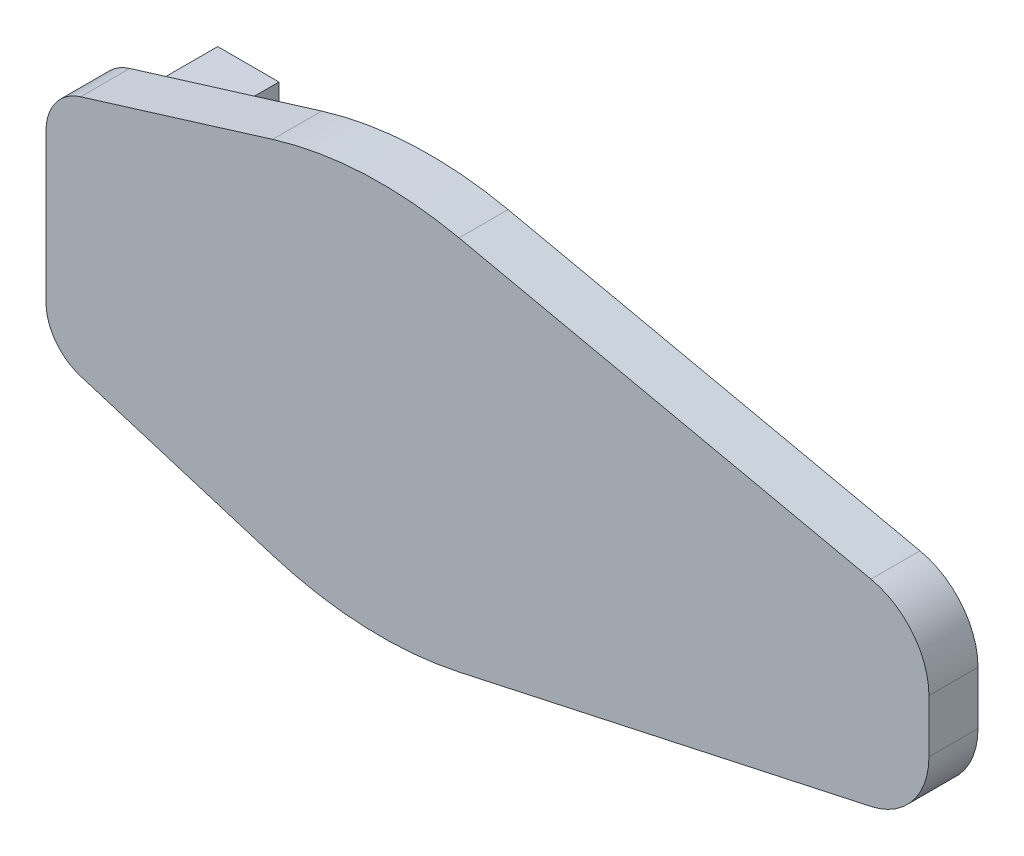
ISO-10303-21;
HEADER;
FILE_DESCRIPTION(('STEP AP214'),'2;1');
FILE_NAME('part.step','',(''),(''),'','','');
FILE_SCHEMA(('AUTOMOTIVE_DESIGN { 1 0 10303 214 1 1 1 1 }'));
ENDSEC;
DATA;
#1=APPLICATION_CONTEXT('core data for automotive mechanical design processes');
#2=APPLICATION_PROTOCOL_DEFINITION('international standard','automotive_design',2000,#1);
#3=PRODUCT_CONTEXT('',#1,'mechanical');
#4=PRODUCT('Part','Part','',(#3));
#5=PRODUCT_RELATED_PRODUCT_CATEGORY('part','',(#4));
#6=PRODUCT_DEFINITION_FORMATION('','',#4);
#7=PRODUCT_DEFINITION_CONTEXT('part definition',#1,'design');
#8=PRODUCT_DEFINITION('design','',#6,#7);
#9=PRODUCT_DEFINITION_SHAPE('','',#8);
#10=(LENGTH_UNIT() NAMED_UNIT(*) SI_UNIT(.MILLI.,.METRE.));
#11=(NAMED_UNIT(*) PLANE_ANGLE_UNIT() SI_UNIT($,.RADIAN.));
#12=(NAMED_UNIT(*) SI_UNIT($,.STERADIAN.) SOLID_ANGLE_UNIT());
#13=UNCERTAINTY_MEASURE_WITH_UNIT(LENGTH_MEASURE(1.E-05),#10,'distance_accuracy_value','');
#14=(GEOMETRIC_REPRESENTATION_CONTEXT(3) GLOBAL_UNCERTAINTY_ASSIGNED_CONTEXT((#13)) GLOBAL_UNIT_ASSIGNED_CONTEXT((#10,
#11,#12)) REPRESENTATION_CONTEXT('',''));
#15=CARTESIAN_POINT('',(0.,0.,0.));
#16=DIRECTION('',(0.,0.,1.));
#17=DIRECTION('',(1.,0.,0.));
#18=AXIS2_PLACEMENT_3D('',#15,#16,#17);
#19=CARTESIAN_POINT('',(27.3089481541044,-13.9852555881266,0.));
#20=DIRECTION('',(0.,0.,1.));
#21=DIRECTION('',(1.,0.,0.));
#22=AXIS2_PLACEMENT_3D('',#19,#20,#21);
#23=PLANE('',#22);
#24=DIRECTION('',(-1.,0.,0.));
#25=VECTOR('',#24,1.);
#26=CARTESIAN_POINT('',(5.,-5.,0.));
#27=LINE('',#26,#25);
#28=CARTESIAN_POINT('',(5.,-5.,0.));
#29=VERTEX_POINT('',#28);
#30=CARTESIAN_POINT('',(0.,-5.,0.));
#31=VERTEX_POINT('',#30);
#32=EDGE_CURVE('E48',#29,#31,#27,.T.);
#33=ORIENTED_EDGE('',*,*,#32,.F.);
#34=DIRECTION('',(0.,-1.,0.));
#35=VECTOR('',#34,1.);
#36=CARTESIAN_POINT('',(5.,-5.,0.));
#37=LINE('',#36,#35);
#38=CARTESIAN_POINT('',(5.,5.,0.));
#39=VERTEX_POINT('',#38);
#40=EDGE_CURVE('E262',#39,#29,#37,.T.);
#41=ORIENTED_EDGE('',*,*,#40,.F.);
#42=DIRECTION('',(1.,0.,0.));
#43=VECTOR('',#42,1.);
#44=CARTESIAN_POINT('',(5.,5.,0.));
#45=LINE('',#44,#43);
#46=CARTESIAN_POINT('',(0.,5.,0.));
#47=VERTEX_POINT('',#46);
#48=EDGE_CURVE('E261',#47,#39,#45,.T.);
#49=ORIENTED_EDGE('',*,*,#48,.F.);
#50=DIRECTION('',(0.,-1.,0.));
#51=VECTOR('',#50,1.);
#52=CARTESIAN_POINT('',(0.,6.04570138192756,0.));
#53=LINE('',#52,#51);
#54=CARTESIAN_POINT('',(0.,6.04570138192756,0.));
#55=VERTEX_POINT('',#54);
#56=EDGE_CURVE('E169',#55,#47,#53,.T.);
#57=ORIENTED_EDGE('',*,*,#56,.F.);
#58=CARTESIAN_POINT('',(4.,6.04570138192756,0.));
#59=DIRECTION('',(0.,0.,1.));
#60=DIRECTION('',(1.,0.,0.));
#61=AXIS2_PLACEMENT_3D('',#58,#59,#60);
#62=CIRCLE('',#61,4.);
#63=CARTESIAN_POINT('',(2.82365660464991,9.86881741681536,0.));
#64=VERTEX_POINT('',#63);
#65=EDGE_CURVE('E207',#64,#55,#62,.T.);
#66=ORIENTED_EDGE('',*,*,#65,.F.);
#67=DIRECTION('',(-0.95577900872195,-0.294085848837522,0.));
#68=VECTOR('',#67,1.);
#69=CARTESIAN_POINT('',(2.82365660464991,9.86881741681536,0.));
#70=LINE('',#69,#68);
#71=CARTESIAN_POINT('',(18.4863726889787,14.6881146735319,0.));
#72=VERTEX_POINT('',#71);
#73=EDGE_CURVE('E173',#72,#64,#70,.T.);
#74=ORIENTED_EDGE('',*,*,#73,.F.);
#75=CARTESIAN_POINT('',(27.3089481541044,-13.9852555881266,0.));
#76=DIRECTION('',(0.,0.,1.));
#77=DIRECTION('',(1.,0.,0.));
#78=AXIS2_PLACEMENT_3D('',#75,#76,#77);
#79=CIRCLE('',#78,30.);
#80=CARTESIAN_POINT('',(33.6818374840357,15.3300353295574,0.));
#81=VERTEX_POINT('',#80);
#82=EDGE_CURVE('E170',#81,#72,#79,.T.);
#83=ORIENTED_EDGE('',*,*,#82,.F.);
#84=DIRECTION('',(-0.977176363922801,0.212429644331044,0.));
#85=VECTOR('',#84,1.);
#86=CARTESIAN_POINT('',(33.6818374840357,15.3300353295574,0.));
#87=LINE('',#86,#85);
#88=CARTESIAN_POINT('',(67.2745778659863,8.02726568130733,0.));
#89=VERTEX_POINT('',#88);
#90=EDGE_CURVE('E183',#89,#81,#87,.T.);
#91=ORIENTED_EDGE('',*,*,#90,.F.);
#92=CARTESIAN_POINT('',(66.,2.16420749777052,0.));
#93=DIRECTION('',(0.,0.,1.));
#94=DIRECTION('',(-1.,0.,0.));
#95=AXIS2_PLACEMENT_3D('',#92,#93,#94);
#96=CIRCLE('',#95,6.00000000000001);
#97=CARTESIAN_POINT('',(72.,2.16420749777052,0.));
#98=VERTEX_POINT('',#97);
#99=EDGE_CURVE('E222',#98,#89,#96,.T.);
#100=ORIENTED_EDGE('',*,*,#99,.F.);
#101=DIRECTION('',(0.,1.,0.));
#102=VECTOR('',#101,1.);
#103=CARTESIAN_POINT('',(72.,2.16420749777052,0.));
#104=LINE('',#103,#102);
#105=CARTESIAN_POINT('',(72.,-2.16420749777052,0.));
#106=VERTEX_POINT('',#105);
#107=EDGE_CURVE('E220',#106,#98,#104,.T.);
#108=ORIENTED_EDGE('',*,*,#107,.F.);
#109=CARTESIAN_POINT('',(66.,-2.16420749777052,0.));
#110=DIRECTION('',(0.,0.,1.));
#111=DIRECTION('',(1.,0.,0.));
#112=AXIS2_PLACEMENT_3D('',#109,#110,#111);
#113=CIRCLE('',#112,6.00000000000001);
#114=CARTESIAN_POINT('',(67.2745778659863,-8.02726568130734,0.));
#115=VERTEX_POINT('',#114);
#116=EDGE_CURVE('E218',#115,#106,#113,.T.);
#117=ORIENTED_EDGE('',*,*,#116,.F.);
#118=DIRECTION('',(0.977176363922801,0.212429644331044,0.));
#119=VECTOR('',#118,1.);
#120=CARTESIAN_POINT('',(33.6818374840357,-15.3300353295574,0.));
#121=LINE('',#120,#119);
#122=CARTESIAN_POINT('',(33.6818374840357,-15.3300353295574,0.));
#123=VERTEX_POINT('',#122);
#124=EDGE_CURVE('E216',#123,#115,#121,.T.);
#125=ORIENTED_EDGE('',*,*,#124,.F.);
#126=CARTESIAN_POINT('',(27.3089481541044,13.9852555881266,0.));
#127=DIRECTION('',(0.,0.,1.));
#128=DIRECTION('',(-1.,0.,0.));
#129=AXIS2_PLACEMENT_3D('',#126,#127,#128);
#130=CIRCLE('',#129,30.);
#131=CARTESIAN_POINT('',(18.4863726889787,-14.6881146735319,0.));
#132=VERTEX_POINT('',#131);
#133=EDGE_CURVE('E214',#132,#123,#130,.T.);
#134=ORIENTED_EDGE('',*,*,#133,.F.);
#135=DIRECTION('',(0.95577900872195,-0.294085848837522,0.));
#136=VECTOR('',#135,1.);
#137=CARTESIAN_POINT('',(2.82365660464991,-9.86881741681536,0.));
#138=LINE('',#137,#136);
#139=CARTESIAN_POINT('',(2.82365660464991,-9.86881741681536,0.));
#140=VERTEX_POINT('',#139);
#141=EDGE_CURVE('E212',#140,#132,#138,.T.);
#142=ORIENTED_EDGE('',*,*,#141,.F.);
#143=CARTESIAN_POINT('',(4.,-6.04570138192756,0.));
#144=DIRECTION('',(0.,0.,1.));
#145=DIRECTION('',(-1.,0.,0.));
#146=AXIS2_PLACEMENT_3D('',#143,#144,#145);
#147=CIRCLE('',#146,4.);
#148=CARTESIAN_POINT('',(0.,-6.04570138192756,0.));
#149=VERTEX_POINT('',#148);
#150=EDGE_CURVE('E210',#149,#140,#147,.T.);
#151=ORIENTED_EDGE('',*,*,#150,.F.);
#152=EDGE_CURVE('E53',#31,#149,#53,.T.);
#153=ORIENTED_EDGE('',*,*,#152,.F.);
#154=EDGE_LOOP('',(#33,#41,#49,#57,#66,#74,#83,#91,#100,#108,#117,#125,#134,#142,#151,#153));
#155=FACE_BOUND('',#154,.T.);
#156=ADVANCED_FACE('F33',(#155),#23,.F.);
#157=CARTESIAN_POINT('',(27.3089481541044,-13.9852555881266,4.));
#158=DIRECTION('',(0.,0.,-1.));
#159=DIRECTION('',(-1.,0.,0.));
#160=AXIS2_PLACEMENT_3D('',#157,#158,#159);
#161=CYLINDRICAL_SURFACE('',#160,30.);
#162=ORIENTED_EDGE('',*,*,#82,.T.);
#163=DIRECTION('',(0.,0.,-1.));
#164=VECTOR('',#163,1.);
#165=CARTESIAN_POINT('',(18.4863726889787,14.6881146735319,4.));
#166=LINE('',#165,#164);
#167=CARTESIAN_POINT('',(18.4863726889787,14.6881146735319,4.));
#168=VERTEX_POINT('',#167);
#169=EDGE_CURVE('E11',#168,#72,#166,.T.);
#170=ORIENTED_EDGE('',*,*,#169,.F.);
#171=CARTESIAN_POINT('',(27.3089481541044,-13.9852555881266,4.));
#172=DIRECTION('',(0.,0.,1.));
#173=DIRECTION('',(1.,0.,0.));
#174=AXIS2_PLACEMENT_3D('',#171,#172,#173);
#175=CIRCLE('',#174,30.);
#176=CARTESIAN_POINT('',(33.6818374840357,15.3300353295574,4.));
#177=VERTEX_POINT('',#176);
#178=EDGE_CURVE('E179',#177,#168,#175,.T.);
#179=ORIENTED_EDGE('',*,*,#178,.F.);
#180=DIRECTION('',(0.,0.,-1.));
#181=VECTOR('',#180,1.);
#182=CARTESIAN_POINT('',(33.6818374840357,15.3300353295574,4.));
#183=LINE('',#182,#181);
#184=EDGE_CURVE('E204',#177,#81,#183,.T.);
#185=ORIENTED_EDGE('',*,*,#184,.T.);
#186=EDGE_LOOP('',(#162,#170,#179,#185));
#187=FACE_BOUND('',#186,.T.);
#188=ADVANCED_FACE('F35',(#187),#161,.T.);
#189=CARTESIAN_POINT('',(2.82365660464991,9.86881741681536,4.));
#190=DIRECTION('',(0.294085848837522,-0.95577900872195,0.));
#191=DIRECTION('',(0.95577900872195,0.294085848837522,0.));
#192=AXIS2_PLACEMENT_3D('',#189,#190,#191);
#193=PLANE('',#192);
#194=ORIENTED_EDGE('',*,*,#73,.T.);
#195=DIRECTION('',(0.,0.,-1.));
#196=VECTOR('',#195,1.);
#197=CARTESIAN_POINT('',(2.82365660464991,9.86881741681536,4.));
#198=LINE('',#197,#196);
#199=CARTESIAN_POINT('',(2.82365660464991,9.86881741681536,4.));
#200=VERTEX_POINT('',#199);
#201=EDGE_CURVE('E41',#200,#64,#198,.T.);
#202=ORIENTED_EDGE('',*,*,#201,.F.);
#203=DIRECTION('',(-0.95577900872195,-0.294085848837522,0.));
#204=VECTOR('',#203,1.);
#205=CARTESIAN_POINT('',(2.82365660464991,9.86881741681536,4.));
#206=LINE('',#205,#204);
#207=EDGE_CURVE('E182',#168,#200,#206,.T.);
#208=ORIENTED_EDGE('',*,*,#207,.F.);
#209=ORIENTED_EDGE('',*,*,#169,.T.);
#210=EDGE_LOOP('',(#194,#202,#208,#209));
#211=FACE_BOUND('',#210,.T.);
#212=ADVANCED_FACE('F301',(#211),#193,.F.);
#213=CARTESIAN_POINT('',(4.,6.04570138192756,4.));
#214=DIRECTION('',(0.,0.,-1.));
#215=DIRECTION('',(-1.,0.,0.));
#216=AXIS2_PLACEMENT_3D('',#213,#214,#215);
#217=CYLINDRICAL_SURFACE('',#216,4.);
#218=ORIENTED_EDGE('',*,*,#65,.T.);
#219=DIRECTION('',(0.,0.,-1.));
#220=VECTOR('',#219,1.);
#221=CARTESIAN_POINT('',(0.,6.04570138192756,4.));
#222=LINE('',#221,#220);
#223=CARTESIAN_POINT('',(0.,6.04570138192756,4.));
#224=VERTEX_POINT('',#223);
#225=EDGE_CURVE('E251',#224,#55,#222,.T.);
#226=ORIENTED_EDGE('',*,*,#225,.F.);
#227=CARTESIAN_POINT('',(4.,6.04570138192756,4.));
#228=DIRECTION('',(0.,0.,1.));
#229=DIRECTION('',(1.,0.,0.));
#230=AXIS2_PLACEMENT_3D('',#227,#228,#229);
#231=CIRCLE('',#230,4.);
#232=EDGE_CURVE('E185',#200,#224,#231,.T.);
#233=ORIENTED_EDGE('',*,*,#232,.F.);
#234=ORIENTED_EDGE('',*,*,#201,.T.);
#235=EDGE_LOOP('',(#218,#226,#233,#234));
#236=FACE_BOUND('',#235,.T.);
#237=ADVANCED_FACE('F257',(#236),#217,.T.);
#238=CARTESIAN_POINT('',(0.,6.04570138192756,4.));
#239=DIRECTION('',(1.,0.,0.));
#240=DIRECTION('',(0.,0.,-1.));
#241=AXIS2_PLACEMENT_3D('',#238,#239,#240);
#242=PLANE('',#241);
#243=CARTESIAN_POINT('',(0.,0.,-5.));
#244=DIRECTION('',(1.,0.,0.));
#245=DIRECTION('',(0.,0.,-1.));
#246=AXIS2_PLACEMENT_3D('',#243,#244,#245);
#247=CIRCLE('',#246,1.55);
#248=CARTESIAN_POINT('',(0.,0.,-6.55));
#249=VERTEX_POINT('',#248);
#250=EDGE_CURVE('E263',#249,#249,#247,.F.);
#251=ORIENTED_EDGE('',*,*,#250,.F.);
#252=EDGE_LOOP('',(#251));
#253=FACE_BOUND('',#252,.T.);
#254=ORIENTED_EDGE('',*,*,#56,.T.);
#255=DIRECTION('',(0.,0.,1.));
#256=VECTOR('',#255,1.);
#257=CARTESIAN_POINT('',(0.,5.,-10.));
#258=LINE('',#257,#256);
#259=CARTESIAN_POINT('',(0.,5.,-10.));
#260=VERTEX_POINT('',#259);
#261=EDGE_CURVE('E149',#260,#47,#258,.T.);
#262=ORIENTED_EDGE('',*,*,#261,.F.);
#263=DIRECTION('',(0.,1.,0.));
#264=VECTOR('',#263,1.);
#265=CARTESIAN_POINT('',(0.,-5.,-10.));
#266=LINE('',#265,#264);
#267=CARTESIAN_POINT('',(0.,-5.,-10.));
#268=VERTEX_POINT('',#267);
#269=EDGE_CURVE('E155',#268,#260,#266,.T.);
#270=ORIENTED_EDGE('',*,*,#269,.F.);
#271=DIRECTION('',(0.,0.,1.));
#272=VECTOR('',#271,1.);
#273=CARTESIAN_POINT('',(0.,-5.,-10.));
#274=LINE('',#273,#272);
#275=EDGE_CURVE('E273',#268,#31,#274,.T.);
#276=ORIENTED_EDGE('',*,*,#275,.T.);
#277=ORIENTED_EDGE('',*,*,#152,.T.);
#278=DIRECTION('',(0.,0.,-1.));
#279=VECTOR('',#278,1.);
#280=CARTESIAN_POINT('',(0.,-6.04570138192756,4.));
#281=LINE('',#280,#279);
#282=CARTESIAN_POINT('',(0.,-6.04570138192756,4.));
#283=VERTEX_POINT('',#282);
#284=EDGE_CURVE('E248',#283,#149,#281,.T.);
#285=ORIENTED_EDGE('',*,*,#284,.F.);
#286=DIRECTION('',(0.,-1.,0.));
#287=VECTOR('',#286,1.);
#288=CARTESIAN_POINT('',(0.,6.04570138192756,4.));
#289=LINE('',#288,#287);
#290=EDGE_CURVE('E187',#224,#283,#289,.T.);
#291=ORIENTED_EDGE('',*,*,#290,.F.);
#292=ORIENTED_EDGE('',*,*,#225,.T.);
#293=EDGE_LOOP('',(#254,#262,#270,#276,#277,#285,#291,#292));
#294=FACE_BOUND('',#293,.T.);
#295=ADVANCED_FACE('F166',(#253,#294),#242,.F.);
#296=CARTESIAN_POINT('',(4.,-6.04570138192756,4.));
#297=DIRECTION('',(0.,0.,-1.));
#298=DIRECTION('',(-1.,0.,0.));
#299=AXIS2_PLACEMENT_3D('',#296,#297,#298);
#300=CYLINDRICAL_SURFACE('',#299,4.);
#301=ORIENTED_EDGE('',*,*,#150,.T.);
#302=DIRECTION('',(0.,0.,-1.));
#303=VECTOR('',#302,1.);
#304=CARTESIAN_POINT('',(2.82365660464991,-9.86881741681536,4.));
#305=LINE('',#304,#303);
#306=CARTESIAN_POINT('',(2.82365660464991,-9.86881741681536,4.));
#307=VERTEX_POINT('',#306);
#308=EDGE_CURVE('E245',#307,#140,#305,.T.);
#309=ORIENTED_EDGE('',*,*,#308,.F.);
#310=CARTESIAN_POINT('',(4.,-6.04570138192756,4.));
#311=DIRECTION('',(0.,0.,1.));
#312=DIRECTION('',(-1.,0.,0.));
#313=AXIS2_PLACEMENT_3D('',#310,#311,#312);
#314=CIRCLE('',#313,4.);
#315=EDGE_CURVE('E189',#283,#307,#314,.T.);
#316=ORIENTED_EDGE('',*,*,#315,.F.);
#317=ORIENTED_EDGE('',*,*,#284,.T.);
#318=EDGE_LOOP('',(#301,#309,#316,#317));
#319=FACE_BOUND('',#318,.T.);
#320=ADVANCED_FACE('F332',(#319),#300,.T.);
#321=CARTESIAN_POINT('',(2.82365660464991,-9.86881741681536,4.));
#322=DIRECTION('',(0.294085848837522,0.95577900872195,0.));
#323=DIRECTION('',(-0.95577900872195,0.294085848837522,0.));
#324=AXIS2_PLACEMENT_3D('',#321,#322,#323);
#325=PLANE('',#324);
#326=ORIENTED_EDGE('',*,*,#141,.T.);
#327=DIRECTION('',(0.,0.,-1.));
#328=VECTOR('',#327,1.);
#329=CARTESIAN_POINT('',(18.4863726889787,-14.6881146735319,4.));
#330=LINE('',#329,#328);
#331=CARTESIAN_POINT('',(18.4863726889787,-14.6881146735319,4.));
#332=VERTEX_POINT('',#331);
#333=EDGE_CURVE('E242',#332,#132,#330,.T.);
#334=ORIENTED_EDGE('',*,*,#333,.F.);
#335=DIRECTION('',(0.95577900872195,-0.294085848837522,0.));
#336=VECTOR('',#335,1.);
#337=CARTESIAN_POINT('',(2.82365660464991,-9.86881741681536,4.));
#338=LINE('',#337,#336);
#339=EDGE_CURVE('E191',#307,#332,#338,.T.);
#340=ORIENTED_EDGE('',*,*,#339,.F.);
#341=ORIENTED_EDGE('',*,*,#308,.T.);
#342=EDGE_LOOP('',(#326,#334,#340,#341));
#343=FACE_BOUND('',#342,.T.);
#344=ADVANCED_FACE('F328',(#343),#325,.F.);
#345=CARTESIAN_POINT('',(27.3089481541044,13.9852555881266,4.));
#346=DIRECTION('',(0.,0.,-1.));
#347=DIRECTION('',(-1.,0.,0.));
#348=AXIS2_PLACEMENT_3D('',#345,#346,#347);
#349=CYLINDRICAL_SURFACE('',#348,30.);
#350=ORIENTED_EDGE('',*,*,#133,.T.);
#351=DIRECTION('',(0.,0.,-1.));
#352=VECTOR('',#351,1.);
#353=CARTESIAN_POINT('',(33.6818374840357,-15.3300353295574,4.));
#354=LINE('',#353,#352);
#355=CARTESIAN_POINT('',(33.6818374840357,-15.3300353295574,4.));
#356=VERTEX_POINT('',#355);
#357=EDGE_CURVE('E239',#356,#123,#354,.T.);
#358=ORIENTED_EDGE('',*,*,#357,.F.);
#359=CARTESIAN_POINT('',(27.3089481541044,13.9852555881266,4.));
#360=DIRECTION('',(0.,0.,1.));
#361=DIRECTION('',(-1.,0.,0.));
#362=AXIS2_PLACEMENT_3D('',#359,#360,#361);
#363=CIRCLE('',#362,30.);
#364=EDGE_CURVE('E193',#332,#356,#363,.T.);
#365=ORIENTED_EDGE('',*,*,#364,.F.);
#366=ORIENTED_EDGE('',*,*,#333,.T.);
#367=EDGE_LOOP('',(#350,#358,#365,#366));
#368=FACE_BOUND('',#367,.T.);
#369=ADVANCED_FACE('F324',(#368),#349,.T.);
#370=CARTESIAN_POINT('',(33.6818374840357,-15.3300353295574,4.));
#371=DIRECTION('',(-0.212429644331044,0.977176363922801,0.));
#372=DIRECTION('',(-0.977176363922801,-0.212429644331044,0.));
#373=AXIS2_PLACEMENT_3D('',#370,#371,#372);
#374=PLANE('',#373);
#375=ORIENTED_EDGE('',*,*,#124,.T.);
#376=DIRECTION('',(0.,0.,-1.));
#377=VECTOR('',#376,1.);
#378=CARTESIAN_POINT('',(67.2745778659863,-8.02726568130734,4.));
#379=LINE('',#378,#377);
#380=CARTESIAN_POINT('',(67.2745778659863,-8.02726568130734,4.));
#381=VERTEX_POINT('',#380);
#382=EDGE_CURVE('E236',#381,#115,#379,.T.);
#383=ORIENTED_EDGE('',*,*,#382,.F.);
#384=DIRECTION('',(0.977176363922801,0.212429644331044,0.));
#385=VECTOR('',#384,1.);
#386=CARTESIAN_POINT('',(33.6818374840357,-15.3300353295574,4.));
#387=LINE('',#386,#385);
#388=EDGE_CURVE('E195',#356,#381,#387,.T.);
#389=ORIENTED_EDGE('',*,*,#388,.F.);
#390=ORIENTED_EDGE('',*,*,#357,.T.);
#391=EDGE_LOOP('',(#375,#383,#389,#390));
#392=FACE_BOUND('',#391,.T.);
#393=ADVANCED_FACE('F320',(#392),#374,.F.);
#394=CARTESIAN_POINT('',(66.,-2.16420749777052,4.));
#395=DIRECTION('',(0.,0.,-1.));
#396=DIRECTION('',(-1.,0.,0.));
#397=AXIS2_PLACEMENT_3D('',#394,#395,#396);
#398=CYLINDRICAL_SURFACE('',#397,6.00000000000001);
#399=ORIENTED_EDGE('',*,*,#116,.T.);
#400=DIRECTION('',(0.,0.,-1.));
#401=VECTOR('',#400,1.);
#402=CARTESIAN_POINT('',(72.,-2.16420749777052,4.));
#403=LINE('',#402,#401);
#404=CARTESIAN_POINT('',(72.,-2.16420749777052,4.));
#405=VERTEX_POINT('',#404);
#406=EDGE_CURVE('E233',#405,#106,#403,.T.);
#407=ORIENTED_EDGE('',*,*,#406,.F.);
#408=CARTESIAN_POINT('',(66.,-2.16420749777052,4.));
#409=DIRECTION('',(0.,0.,1.));
#410=DIRECTION('',(1.,0.,0.));
#411=AXIS2_PLACEMENT_3D('',#408,#409,#410);
#412=CIRCLE('',#411,6.00000000000001);
#413=EDGE_CURVE('E197',#381,#405,#412,.T.);
#414=ORIENTED_EDGE('',*,*,#413,.F.);
#415=ORIENTED_EDGE('',*,*,#382,.T.);
#416=EDGE_LOOP('',(#399,#407,#414,#415));
#417=FACE_BOUND('',#416,.T.);
#418=ADVANCED_FACE('F316',(#417),#398,.T.);
#419=CARTESIAN_POINT('',(72.,2.16420749777052,4.));
#420=DIRECTION('',(-1.,0.,0.));
#421=DIRECTION('',(0.,0.,1.));
#422=AXIS2_PLACEMENT_3D('',#419,#420,#421);
#423=PLANE('',#422);
#424=ORIENTED_EDGE('',*,*,#107,.T.);
#425=DIRECTION('',(0.,0.,-1.));
#426=VECTOR('',#425,1.);
#427=CARTESIAN_POINT('',(72.,2.16420749777052,4.));
#428=LINE('',#427,#426);
#429=CARTESIAN_POINT('',(72.,2.16420749777052,4.));
#430=VERTEX_POINT('',#429);
#431=EDGE_CURVE('E230',#430,#98,#428,.T.);
#432=ORIENTED_EDGE('',*,*,#431,.F.);
#433=DIRECTION('',(0.,1.,0.));
#434=VECTOR('',#433,1.);
#435=CARTESIAN_POINT('',(72.,2.16420749777052,4.));
#436=LINE('',#435,#434);
#437=EDGE_CURVE('E199',#405,#430,#436,.T.);
#438=ORIENTED_EDGE('',*,*,#437,.F.);
#439=ORIENTED_EDGE('',*,*,#406,.T.);
#440=EDGE_LOOP('',(#424,#432,#438,#439));
#441=FACE_BOUND('',#440,.T.);
#442=ADVANCED_FACE('F312',(#441),#423,.F.);
#443=CARTESIAN_POINT('',(66.,2.16420749777052,4.));
#444=DIRECTION('',(0.,0.,-1.));
#445=DIRECTION('',(-1.,0.,0.));
#446=AXIS2_PLACEMENT_3D('',#443,#444,#445);
#447=CYLINDRICAL_SURFACE('',#446,6.00000000000001);
#448=ORIENTED_EDGE('',*,*,#99,.T.);
#449=DIRECTION('',(0.,0.,-1.));
#450=VECTOR('',#449,1.);
#451=CARTESIAN_POINT('',(67.2745778659863,8.02726568130733,4.));
#452=LINE('',#451,#450);
#453=CARTESIAN_POINT('',(67.2745778659863,8.02726568130733,4.));
#454=VERTEX_POINT('',#453);
#455=EDGE_CURVE('E227',#454,#89,#452,.T.);
#456=ORIENTED_EDGE('',*,*,#455,.F.);
#457=CARTESIAN_POINT('',(66.,2.16420749777052,4.));
#458=DIRECTION('',(0.,0.,1.));
#459=DIRECTION('',(-1.,0.,0.));
#460=AXIS2_PLACEMENT_3D('',#457,#458,#459);
#461=CIRCLE('',#460,6.00000000000001);
#462=EDGE_CURVE('E201',#430,#454,#461,.T.);
#463=ORIENTED_EDGE('',*,*,#462,.F.);
#464=ORIENTED_EDGE('',*,*,#431,.T.);
#465=EDGE_LOOP('',(#448,#456,#463,#464));
#466=FACE_BOUND('',#465,.T.);
#467=ADVANCED_FACE('F308',(#466),#447,.T.);
#468=CARTESIAN_POINT('',(33.6818374840357,15.3300353295574,4.));
#469=DIRECTION('',(-0.212429644331044,-0.977176363922801,0.));
#470=DIRECTION('',(0.977176363922801,-0.212429644331044,0.));
#471=AXIS2_PLACEMENT_3D('',#468,#469,#470);
#472=PLANE('',#471);
#473=ORIENTED_EDGE('',*,*,#90,.T.);
#474=ORIENTED_EDGE('',*,*,#184,.F.);
#475=DIRECTION('',(-0.977176363922801,0.212429644331044,0.));
#476=VECTOR('',#475,1.);
#477=CARTESIAN_POINT('',(33.6818374840357,15.3300353295574,4.));
#478=LINE('',#477,#476);
#479=EDGE_CURVE('E203',#454,#177,#478,.T.);
#480=ORIENTED_EDGE('',*,*,#479,.F.);
#481=ORIENTED_EDGE('',*,*,#455,.T.);
#482=EDGE_LOOP('',(#473,#474,#480,#481));
#483=FACE_BOUND('',#482,.T.);
#484=ADVANCED_FACE('F305',(#483),#472,.F.);
#485=CARTESIAN_POINT('',(27.3089481541044,-13.9852555881266,4.));
#486=DIRECTION('',(0.,0.,1.));
#487=DIRECTION('',(1.,0.,0.));
#488=AXIS2_PLACEMENT_3D('',#485,#486,#487);
#489=PLANE('',#488);
#490=ORIENTED_EDGE('',*,*,#178,.T.);
#491=ORIENTED_EDGE('',*,*,#207,.T.);
#492=ORIENTED_EDGE('',*,*,#232,.T.);
#493=ORIENTED_EDGE('',*,*,#290,.T.);
#494=ORIENTED_EDGE('',*,*,#315,.T.);
#495=ORIENTED_EDGE('',*,*,#339,.T.);
#496=ORIENTED_EDGE('',*,*,#364,.T.);
#497=ORIENTED_EDGE('',*,*,#388,.T.);
#498=ORIENTED_EDGE('',*,*,#413,.T.);
#499=ORIENTED_EDGE('',*,*,#437,.T.);
#500=ORIENTED_EDGE('',*,*,#462,.T.);
#501=ORIENTED_EDGE('',*,*,#479,.T.);
#502=EDGE_LOOP('',(#490,#491,#492,#493,#494,#495,#496,#497,#498,#499,#500,#501));
#503=FACE_BOUND('',#502,.T.);
#504=ADVANCED_FACE('F294',(#503),#489,.T.);
#505=CARTESIAN_POINT('',(5.,5.,-10.));
#506=DIRECTION('',(0.,-1.,0.));
#507=DIRECTION('',(0.,0.,-1.));
#508=AXIS2_PLACEMENT_3D('',#505,#506,#507);
#509=PLANE('',#508);
#510=ORIENTED_EDGE('',*,*,#48,.T.);
#511=DIRECTION('',(0.,0.,1.));
#512=VECTOR('',#511,1.);
#513=CARTESIAN_POINT('',(5.,5.,-10.));
#514=LINE('',#513,#512);
#515=CARTESIAN_POINT('',(5.,5.,-10.));
#516=VERTEX_POINT('',#515);
#517=EDGE_CURVE('E151',#516,#39,#514,.T.);
#518=ORIENTED_EDGE('',*,*,#517,.F.);
#519=DIRECTION('',(1.,0.,0.));
#520=VECTOR('',#519,1.);
#521=CARTESIAN_POINT('',(5.,5.,-10.));
#522=LINE('',#521,#520);
#523=EDGE_CURVE('E144',#260,#516,#522,.T.);
#524=ORIENTED_EDGE('',*,*,#523,.F.);
#525=ORIENTED_EDGE('',*,*,#261,.T.);
#526=EDGE_LOOP('',(#510,#518,#524,#525));
#527=FACE_BOUND('',#526,.T.);
#528=ADVANCED_FACE('F147',(#527),#509,.F.);
#529=CARTESIAN_POINT('',(5.,-5.,-10.));
#530=DIRECTION('',(-1.,0.,0.));
#531=DIRECTION('',(0.,0.,1.));
#532=AXIS2_PLACEMENT_3D('',#529,#530,#531);
#533=PLANE('',#532);
#534=CARTESIAN_POINT('',(5.,0.,-5.));
#535=DIRECTION('',(1.,0.,0.));
#536=DIRECTION('',(0.,0.,-1.));
#537=AXIS2_PLACEMENT_3D('',#534,#535,#536);
#538=CIRCLE('',#537,1.55);
#539=CARTESIAN_POINT('',(5.,0.,-6.55));
#540=VERTEX_POINT('',#539);
#541=EDGE_CURVE('E267',#540,#540,#538,.T.);
#542=ORIENTED_EDGE('',*,*,#541,.F.);
#543=EDGE_LOOP('',(#542));
#544=FACE_BOUND('',#543,.T.);
#545=ORIENTED_EDGE('',*,*,#40,.T.);
#546=DIRECTION('',(0.,0.,1.));
#547=VECTOR('',#546,1.);
#548=CARTESIAN_POINT('',(5.,-5.,-10.));
#549=LINE('',#548,#547);
#550=CARTESIAN_POINT('',(5.,-5.,-10.));
#551=VERTEX_POINT('',#550);
#552=EDGE_CURVE('E175',#551,#29,#549,.T.);
#553=ORIENTED_EDGE('',*,*,#552,.F.);
#554=DIRECTION('',(0.,-1.,0.));
#555=VECTOR('',#554,1.);
#556=CARTESIAN_POINT('',(5.,-5.,-10.));
#557=LINE('',#556,#555);
#558=EDGE_CURVE('E154',#516,#551,#557,.T.);
#559=ORIENTED_EDGE('',*,*,#558,.F.);
#560=ORIENTED_EDGE('',*,*,#517,.T.);
#561=EDGE_LOOP('',(#545,#553,#559,#560));
#562=FACE_BOUND('',#561,.T.);
#563=ADVANCED_FACE('F279',(#544,#562),#533,.F.);
#564=CARTESIAN_POINT('',(5.,-5.,-10.));
#565=DIRECTION('',(0.,1.,0.));
#566=DIRECTION('',(-1.,0.,0.));
#567=AXIS2_PLACEMENT_3D('',#564,#565,#566);
#568=PLANE('',#567);
#569=ORIENTED_EDGE('',*,*,#32,.T.);
#570=ORIENTED_EDGE('',*,*,#275,.F.);
#571=DIRECTION('',(-1.,0.,0.));
#572=VECTOR('',#571,1.);
#573=CARTESIAN_POINT('',(5.,-5.,-10.));
#574=LINE('',#573,#572);
#575=EDGE_CURVE('E160',#551,#268,#574,.T.);
#576=ORIENTED_EDGE('',*,*,#575,.F.);
#577=ORIENTED_EDGE('',*,*,#552,.T.);
#578=EDGE_LOOP('',(#569,#570,#576,#577));
#579=FACE_BOUND('',#578,.T.);
#580=ADVANCED_FACE('F277',(#579),#568,.F.);
#581=CARTESIAN_POINT('',(0.,0.,-10.));
#582=DIRECTION('',(0.,0.,1.));
#583=DIRECTION('',(1.,0.,0.));
#584=AXIS2_PLACEMENT_3D('',#581,#582,#583);
#585=PLANE('',#584);
#586=ORIENTED_EDGE('',*,*,#269,.T.);
#587=ORIENTED_EDGE('',*,*,#523,.T.);
#588=ORIENTED_EDGE('',*,*,#558,.T.);
#589=ORIENTED_EDGE('',*,*,#575,.T.);
#590=EDGE_LOOP('',(#586,#587,#588,#589));
#591=FACE_BOUND('',#590,.T.);
#592=ADVANCED_FACE('F158',(#591),#585,.F.);
#593=CARTESIAN_POINT('',(-0.00100000000000013,0.,-5.));
#594=DIRECTION('',(1.,0.,0.));
#595=DIRECTION('',(0.,0.,-1.));
#596=AXIS2_PLACEMENT_3D('',#593,#594,#595);
#597=CYLINDRICAL_SURFACE('',#596,1.55);
#598=ORIENTED_EDGE('',*,*,#541,.T.);
#599=EDGE_LOOP('',(#598));
#600=FACE_BOUND('',#599,.T.);
#601=ORIENTED_EDGE('',*,*,#250,.T.);
#602=EDGE_LOOP('',(#601));
#603=FACE_BOUND('',#602,.T.);
#604=ADVANCED_FACE('F284',(#600,#603),#597,.F.);
#605=CLOSED_SHELL('',(#156,#188,#212,#237,#295,#320,#344,#369,#393,#418,#442,#467,#484,#504,
#528,#563,#580,#592,#604));
#606=MANIFOLD_SOLID_BREP('B2',#605);
#607=ADVANCED_BREP_SHAPE_REPRESENTATION('',(#18,#606),#14);
#608=SHAPE_DEFINITION_REPRESENTATION(#9,#607);
ENDSEC;
END-ISO-10303-21;
